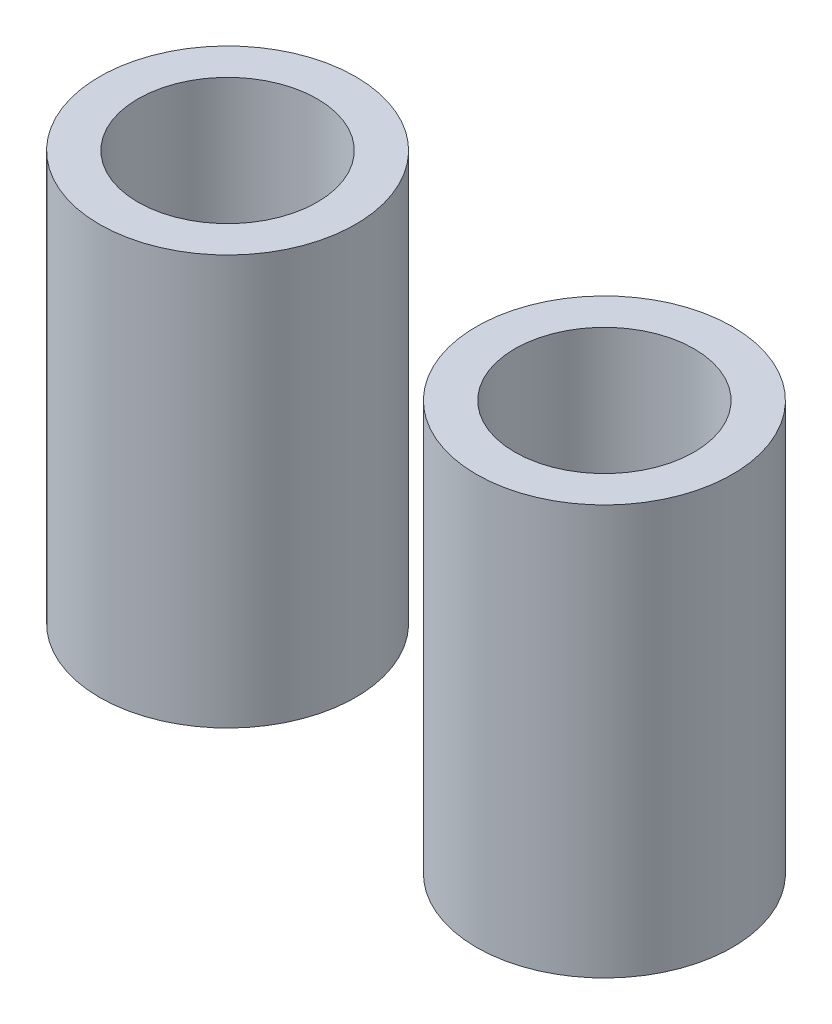
ISO-10303-21;
HEADER;
FILE_DESCRIPTION(('STEP AP214'),'2;1');
FILE_NAME('part.step','',(''),(''),'','','');
FILE_SCHEMA(('AUTOMOTIVE_DESIGN { 1 0 10303 214 1 1 1 1 }'));
ENDSEC;
DATA;
#1=APPLICATION_CONTEXT('core data for automotive mechanical design processes');
#2=APPLICATION_PROTOCOL_DEFINITION('international standard','automotive_design',2000,#1);
#3=PRODUCT_CONTEXT('',#1,'mechanical');
#4=PRODUCT('Part','Part','',(#3));
#5=PRODUCT_RELATED_PRODUCT_CATEGORY('part','',(#4));
#6=PRODUCT_DEFINITION_FORMATION('','',#4);
#7=PRODUCT_DEFINITION_CONTEXT('part definition',#1,'design');
#8=PRODUCT_DEFINITION('design','',#6,#7);
#9=PRODUCT_DEFINITION_SHAPE('','',#8);
#10=(LENGTH_UNIT() NAMED_UNIT(*) SI_UNIT(.MILLI.,.METRE.));
#11=(NAMED_UNIT(*) PLANE_ANGLE_UNIT() SI_UNIT($,.RADIAN.));
#12=(NAMED_UNIT(*) SI_UNIT($,.STERADIAN.) SOLID_ANGLE_UNIT());
#13=UNCERTAINTY_MEASURE_WITH_UNIT(LENGTH_MEASURE(1.E-05),#10,'distance_accuracy_value','');
#14=(GEOMETRIC_REPRESENTATION_CONTEXT(3) GLOBAL_UNCERTAINTY_ASSIGNED_CONTEXT((#13)) GLOBAL_UNIT_ASSIGNED_CONTEXT((#10,
#11,#12)) REPRESENTATION_CONTEXT('',''));
#15=CARTESIAN_POINT('',(0.,0.,0.));
#16=DIRECTION('',(0.,0.,1.));
#17=DIRECTION('',(1.,0.,0.));
#18=AXIS2_PLACEMENT_3D('',#15,#16,#17);
#19=CARTESIAN_POINT('',(7.90682537130945,8.,0.547727598385891));
#20=DIRECTION('',(0.,1.,0.));
#21=DIRECTION('',(0.,0.,1.));
#22=AXIS2_PLACEMENT_3D('',#19,#20,#21);
#23=PLANE('',#22);
#24=CARTESIAN_POINT('',(7.90682537130945,8.,0.547727598385891));
#25=DIRECTION('',(0.,1.,0.));
#26=DIRECTION('',(0.,0.,1.));
#27=AXIS2_PLACEMENT_3D('',#24,#25,#26);
#28=CIRCLE('',#27,2.5);
#29=CARTESIAN_POINT('',(7.90682537130945,8.,3.04772759838589));
#30=VERTEX_POINT('',#29);
#31=EDGE_CURVE('E11',#30,#30,#28,.T.);
#32=ORIENTED_EDGE('',*,*,#31,.T.);
#33=EDGE_LOOP('',(#32));
#34=FACE_BOUND('',#33,.T.);
#35=CARTESIAN_POINT('',(7.90682537130945,8.,0.547727598385891));
#36=DIRECTION('',(0.,1.,0.));
#37=DIRECTION('',(0.,0.,1.));
#38=AXIS2_PLACEMENT_3D('',#35,#36,#37);
#39=CIRCLE('',#38,1.75);
#40=CARTESIAN_POINT('',(7.90682537130945,8.,2.29772759838589));
#41=VERTEX_POINT('',#40);
#42=EDGE_CURVE('E54',#41,#41,#39,.T.);
#43=ORIENTED_EDGE('',*,*,#42,.F.);
#44=EDGE_LOOP('',(#43));
#45=FACE_BOUND('',#44,.T.);
#46=ADVANCED_FACE('F43',(#34,#45),#23,.T.);
#47=CARTESIAN_POINT('',(7.90682537130945,0.,0.547727598385891));
#48=DIRECTION('',(0.,1.,0.));
#49=DIRECTION('',(0.,0.,1.));
#50=AXIS2_PLACEMENT_3D('',#47,#48,#49);
#51=PLANE('',#50);
#52=CARTESIAN_POINT('',(7.90682537130945,0.,0.547727598385891));
#53=DIRECTION('',(0.,1.,0.));
#54=DIRECTION('',(0.,0.,1.));
#55=AXIS2_PLACEMENT_3D('',#52,#53,#54);
#56=CIRCLE('',#55,2.5);
#57=CARTESIAN_POINT('',(7.90682537130945,0.,3.04772759838589));
#58=VERTEX_POINT('',#57);
#59=EDGE_CURVE('E47',#58,#58,#56,.T.);
#60=ORIENTED_EDGE('',*,*,#59,.F.);
#61=EDGE_LOOP('',(#60));
#62=FACE_BOUND('',#61,.T.);
#63=CARTESIAN_POINT('',(7.90682537130945,0.,0.547727598385891));
#64=DIRECTION('',(0.,1.,0.));
#65=DIRECTION('',(0.,0.,1.));
#66=AXIS2_PLACEMENT_3D('',#63,#64,#65);
#67=CIRCLE('',#66,1.75);
#68=CARTESIAN_POINT('',(7.90682537130945,0.,2.29772759838589));
#69=VERTEX_POINT('',#68);
#70=EDGE_CURVE('E56',#69,#69,#67,.T.);
#71=ORIENTED_EDGE('',*,*,#70,.T.);
#72=EDGE_LOOP('',(#71));
#73=FACE_BOUND('',#72,.T.);
#74=ADVANCED_FACE('F66',(#62,#73),#51,.F.);
#75=CARTESIAN_POINT('',(7.90682537130945,8.,0.547727598385891));
#76=DIRECTION('',(0.,-1.,0.));
#77=DIRECTION('',(0.,0.,-1.));
#78=AXIS2_PLACEMENT_3D('',#75,#76,#77);
#79=CYLINDRICAL_SURFACE('',#78,2.5);
#80=ORIENTED_EDGE('',*,*,#31,.F.);
#81=EDGE_LOOP('',(#80));
#82=FACE_BOUND('',#81,.T.);
#83=ORIENTED_EDGE('',*,*,#59,.T.);
#84=EDGE_LOOP('',(#83));
#85=FACE_BOUND('',#84,.T.);
#86=ADVANCED_FACE('F45',(#82,#85),#79,.T.);
#87=CARTESIAN_POINT('',(7.90682537130945,8.,0.547727598385891));
#88=DIRECTION('',(0.,-1.,0.));
#89=DIRECTION('',(0.,0.,-1.));
#90=AXIS2_PLACEMENT_3D('',#87,#88,#89);
#91=CYLINDRICAL_SURFACE('',#90,1.75);
#92=ORIENTED_EDGE('',*,*,#42,.T.);
#93=EDGE_LOOP('',(#92));
#94=FACE_BOUND('',#93,.T.);
#95=ORIENTED_EDGE('',*,*,#70,.F.);
#96=EDGE_LOOP('',(#95));
#97=FACE_BOUND('',#96,.T.);
#98=ADVANCED_FACE('F62',(#94,#97),#91,.F.);
#99=CLOSED_SHELL('',(#46,#74,#86,#98));
#100=MANIFOLD_SOLID_BREP('B2',#99);
#101=CARTESIAN_POINT('',(0.,8.,0.));
#102=DIRECTION('',(0.,1.,0.));
#103=DIRECTION('',(0.,0.,1.));
#104=AXIS2_PLACEMENT_3D('',#101,#102,#103);
#105=PLANE('',#104);
#106=CARTESIAN_POINT('',(0.,8.,0.));
#107=DIRECTION('',(0.,1.,0.));
#108=DIRECTION('',(0.,0.,1.));
#109=AXIS2_PLACEMENT_3D('',#106,#107,#108);
#110=CIRCLE('',#109,2.5);
#111=CARTESIAN_POINT('',(0.,8.,2.5));
#112=VERTEX_POINT('',#111);
#113=EDGE_CURVE('E42',#112,#112,#110,.T.);
#114=ORIENTED_EDGE('',*,*,#113,.T.);
#115=EDGE_LOOP('',(#114));
#116=FACE_BOUND('',#115,.T.);
#117=CARTESIAN_POINT('',(0.,8.,0.));
#118=DIRECTION('',(0.,1.,0.));
#119=DIRECTION('',(0.,0.,1.));
#120=AXIS2_PLACEMENT_3D('',#117,#118,#119);
#121=CIRCLE('',#120,1.75);
#122=CARTESIAN_POINT('',(0.,8.,1.75));
#123=VERTEX_POINT('',#122);
#124=EDGE_CURVE('E124',#123,#123,#121,.T.);
#125=ORIENTED_EDGE('',*,*,#124,.F.);
#126=EDGE_LOOP('',(#125));
#127=FACE_BOUND('',#126,.T.);
#128=ADVANCED_FACE('F113',(#116,#127),#105,.T.);
#129=CARTESIAN_POINT('',(0.,0.,0.));
#130=DIRECTION('',(0.,1.,0.));
#131=DIRECTION('',(0.,0.,1.));
#132=AXIS2_PLACEMENT_3D('',#129,#130,#131);
#133=PLANE('',#132);
#134=CARTESIAN_POINT('',(0.,0.,0.));
#135=DIRECTION('',(0.,1.,0.));
#136=DIRECTION('',(0.,0.,1.));
#137=AXIS2_PLACEMENT_3D('',#134,#135,#136);
#138=CIRCLE('',#137,2.5);
#139=CARTESIAN_POINT('',(0.,0.,2.5));
#140=VERTEX_POINT('',#139);
#141=EDGE_CURVE('E117',#140,#140,#138,.T.);
#142=ORIENTED_EDGE('',*,*,#141,.F.);
#143=EDGE_LOOP('',(#142));
#144=FACE_BOUND('',#143,.T.);
#145=CARTESIAN_POINT('',(0.,0.,0.));
#146=DIRECTION('',(0.,1.,0.));
#147=DIRECTION('',(0.,0.,1.));
#148=AXIS2_PLACEMENT_3D('',#145,#146,#147);
#149=CIRCLE('',#148,1.75);
#150=CARTESIAN_POINT('',(0.,0.,1.75));
#151=VERTEX_POINT('',#150);
#152=EDGE_CURVE('E126',#151,#151,#149,.T.);
#153=ORIENTED_EDGE('',*,*,#152,.T.);
#154=EDGE_LOOP('',(#153));
#155=FACE_BOUND('',#154,.T.);
#156=ADVANCED_FACE('F136',(#144,#155),#133,.F.);
#157=CARTESIAN_POINT('',(0.,8.,0.));
#158=DIRECTION('',(0.,-1.,0.));
#159=DIRECTION('',(0.,0.,-1.));
#160=AXIS2_PLACEMENT_3D('',#157,#158,#159);
#161=CYLINDRICAL_SURFACE('',#160,2.5);
#162=ORIENTED_EDGE('',*,*,#113,.F.);
#163=EDGE_LOOP('',(#162));
#164=FACE_BOUND('',#163,.T.);
#165=ORIENTED_EDGE('',*,*,#141,.T.);
#166=EDGE_LOOP('',(#165));
#167=FACE_BOUND('',#166,.T.);
#168=ADVANCED_FACE('F115',(#164,#167),#161,.T.);
#169=CARTESIAN_POINT('',(0.,8.,0.));
#170=DIRECTION('',(0.,-1.,0.));
#171=DIRECTION('',(0.,0.,-1.));
#172=AXIS2_PLACEMENT_3D('',#169,#170,#171);
#173=CYLINDRICAL_SURFACE('',#172,1.75);
#174=ORIENTED_EDGE('',*,*,#124,.T.);
#175=EDGE_LOOP('',(#174));
#176=FACE_BOUND('',#175,.T.);
#177=ORIENTED_EDGE('',*,*,#152,.F.);
#178=EDGE_LOOP('',(#177));
#179=FACE_BOUND('',#178,.T.);
#180=ADVANCED_FACE('F132',(#176,#179),#173,.F.);
#181=CLOSED_SHELL('',(#128,#156,#168,#180));
#182=MANIFOLD_SOLID_BREP('B6',#181);
#183=ADVANCED_BREP_SHAPE_REPRESENTATION('',(#18,#100,#182),#14);
#184=SHAPE_DEFINITION_REPRESENTATION(#9,#183);
ENDSEC;
END-ISO-10303-21;
